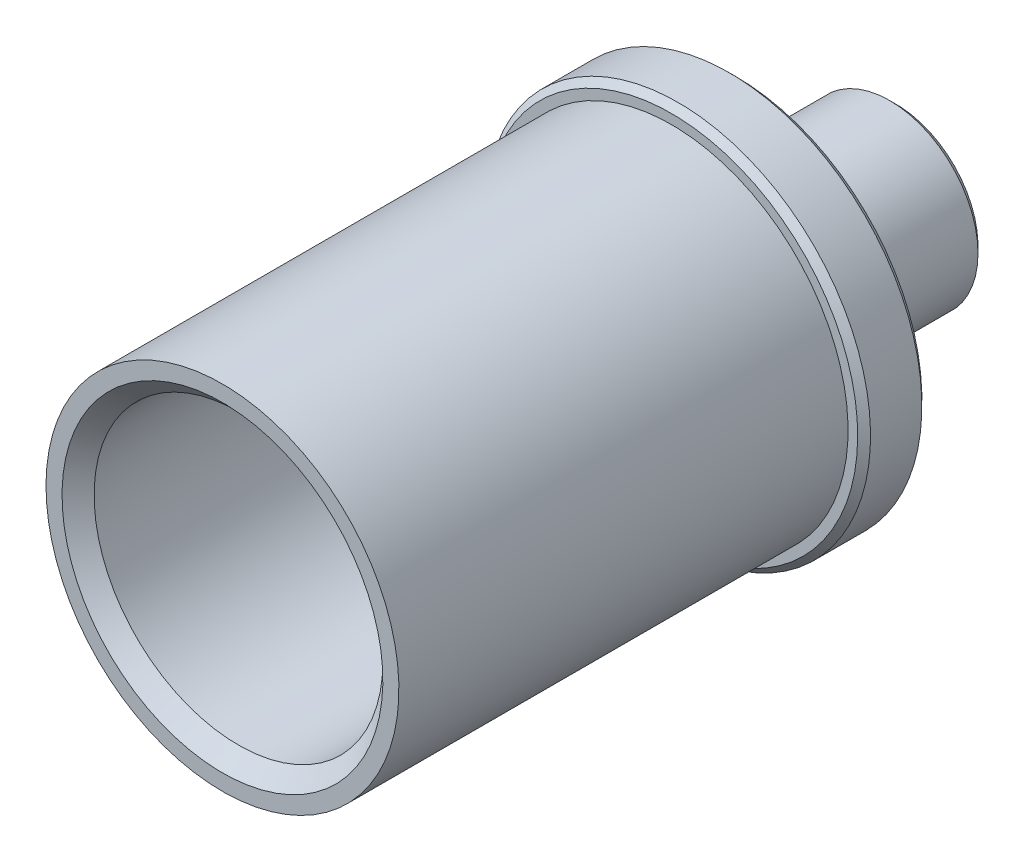
ISO-10303-21;
HEADER;
FILE_DESCRIPTION(('STEP AP214'),'2;1');
FILE_NAME('part.step','',(''),(''),'','','');
FILE_SCHEMA(('AUTOMOTIVE_DESIGN { 1 0 10303 214 1 1 1 1 }'));
ENDSEC;
DATA;
#1=APPLICATION_CONTEXT('core data for automotive mechanical design processes');
#2=APPLICATION_PROTOCOL_DEFINITION('international standard','automotive_design',2000,#1);
#3=PRODUCT_CONTEXT('',#1,'mechanical');
#4=PRODUCT('Part','Part','',(#3));
#5=PRODUCT_RELATED_PRODUCT_CATEGORY('part','',(#4));
#6=PRODUCT_DEFINITION_FORMATION('','',#4);
#7=PRODUCT_DEFINITION_CONTEXT('part definition',#1,'design');
#8=PRODUCT_DEFINITION('design','',#6,#7);
#9=PRODUCT_DEFINITION_SHAPE('','',#8);
#10=(LENGTH_UNIT() NAMED_UNIT(*) SI_UNIT(.MILLI.,.METRE.));
#11=(NAMED_UNIT(*) PLANE_ANGLE_UNIT() SI_UNIT($,.RADIAN.));
#12=(NAMED_UNIT(*) SI_UNIT($,.STERADIAN.) SOLID_ANGLE_UNIT());
#13=UNCERTAINTY_MEASURE_WITH_UNIT(LENGTH_MEASURE(1.E-05),#10,'distance_accuracy_value','');
#14=(GEOMETRIC_REPRESENTATION_CONTEXT(3) GLOBAL_UNCERTAINTY_ASSIGNED_CONTEXT((#13)) GLOBAL_UNIT_ASSIGNED_CONTEXT((#10,
#11,#12)) REPRESENTATION_CONTEXT('',''));
#15=CARTESIAN_POINT('',(0.,0.,0.));
#16=DIRECTION('',(0.,0.,1.));
#17=DIRECTION('',(1.,0.,0.));
#18=AXIS2_PLACEMENT_3D('',#15,#16,#17);
#19=CARTESIAN_POINT('',(-24.8651646720952,0.164165824894193,10.45));
#20=DIRECTION('',(0.,0.,1.));
#21=DIRECTION('',(-0.119393327195775,-0.992847034251059,0.));
#22=AXIS2_PLACEMENT_3D('',#19,#20,#21);
#23=PLANE('',#22);
#24=CARTESIAN_POINT('',(-23.5,0.,10.45));
#25=DIRECTION('',(0.,0.,-1.));
#26=DIRECTION('',(-0.119393327195775,-0.992847034251059,0.));
#27=AXIS2_PLACEMENT_3D('',#24,#25,#26);
#28=CIRCLE('',#27,1.275);
#29=CARTESIAN_POINT('',(-23.6522264921746,-1.2658799686701,10.45));
#30=VERTEX_POINT('',#29);
#31=EDGE_CURVE('E49',#30,#30,#28,.T.);
#32=ORIENTED_EDGE('',*,*,#31,.T.);
#33=EDGE_LOOP('',(#32));
#34=FACE_BOUND('',#33,.T.);
#35=ADVANCED_FACE('F15',(#34),#23,.F.);
#36=CARTESIAN_POINT('',(-26.4785411027531,0.358179981587328,12.95));
#37=DIRECTION('',(0.,0.,1.));
#38=DIRECTION('',(-0.119393327195775,-0.992847034251059,0.));
#39=AXIS2_PLACEMENT_3D('',#36,#37,#38);
#40=PLANE('',#39);
#41=CARTESIAN_POINT('',(-23.5,0.,12.95));
#42=DIRECTION('',(0.,0.,-1.));
#43=DIRECTION('',(0.119393327195775,0.992847034251059,0.));
#44=AXIS2_PLACEMENT_3D('',#41,#42,#43);
#45=CIRCLE('',#44,1.375);
#46=CARTESIAN_POINT('',(-23.3358341751058,1.36516467209521,12.95));
#47=VERTEX_POINT('',#46);
#48=EDGE_CURVE('E44',#47,#47,#45,.T.);
#49=ORIENTED_EDGE('',*,*,#48,.F.);
#50=EDGE_LOOP('',(#49));
#51=FACE_BOUND('',#50,.T.);
#52=CARTESIAN_POINT('',(-23.5,0.,12.95));
#53=DIRECTION('',(0.,0.,-1.));
#54=DIRECTION('',(-0.119393327195775,-0.992847034251059,0.));
#55=AXIS2_PLACEMENT_3D('',#52,#53,#54);
#56=CIRCLE('',#55,2.9);
#57=CARTESIAN_POINT('',(-23.8462406488677,-2.87925639932807,12.95));
#58=VERTEX_POINT('',#57);
#59=EDGE_CURVE('E54',#58,#58,#56,.T.);
#60=ORIENTED_EDGE('',*,*,#59,.T.);
#61=EDGE_LOOP('',(#60));
#62=FACE_BOUND('',#61,.T.);
#63=ADVANCED_FACE('F88',(#51,#62),#40,.F.);
#64=CARTESIAN_POINT('',(-23.5,0.,13.95));
#65=DIRECTION('',(0.,0.,-1.));
#66=DIRECTION('',(0.119393327195775,0.992847034251059,0.));
#67=AXIS2_PLACEMENT_3D('',#64,#65,#66);
#68=PLANE('',#67);
#69=CARTESIAN_POINT('',(-23.5,0.,13.95));
#70=DIRECTION('',(0.,0.,-1.));
#71=DIRECTION('',(0.119393327195775,0.992847034251059,0.));
#72=AXIS2_PLACEMENT_3D('',#69,#70,#71);
#73=CIRCLE('',#72,2.75);
#74=CARTESIAN_POINT('',(-23.1716683502116,2.73032934419041,13.95));
#75=VERTEX_POINT('',#74);
#76=EDGE_CURVE('E19',#75,#75,#73,.T.);
#77=ORIENTED_EDGE('',*,*,#76,.T.);
#78=EDGE_LOOP('',(#77));
#79=FACE_BOUND('',#78,.T.);
#80=CARTESIAN_POINT('',(-23.5,0.,13.95));
#81=DIRECTION('',(0.,0.,1.));
#82=DIRECTION('',(0.119393327195775,0.992847034251059,0.));
#83=AXIS2_PLACEMENT_3D('',#80,#81,#82);
#84=CIRCLE('',#83,2.9);
#85=CARTESIAN_POINT('',(-23.1537593511323,2.87925639932807,13.95));
#86=VERTEX_POINT('',#85);
#87=EDGE_CURVE('E40',#86,#86,#84,.T.);
#88=ORIENTED_EDGE('',*,*,#87,.T.);
#89=EDGE_LOOP('',(#88));
#90=FACE_BOUND('',#89,.T.);
#91=ADVANCED_FACE('F17',(#79,#90),#68,.F.);
#92=CARTESIAN_POINT('',(-25.7339058270649,0.268634986190496,20.95));
#93=DIRECTION('',(0.,0.,-1.));
#94=DIRECTION('',(0.119393327195775,0.992847034251059,0.));
#95=AXIS2_PLACEMENT_3D('',#92,#93,#94);
#96=PLANE('',#95);
#97=CARTESIAN_POINT('',(-23.5,0.,20.95));
#98=DIRECTION('',(0.,0.,-1.));
#99=DIRECTION('',(0.119393327195775,0.992847034251059,0.));
#100=AXIS2_PLACEMENT_3D('',#97,#98,#99);
#101=CIRCLE('',#100,2.75);
#102=CARTESIAN_POINT('',(-23.1716683502116,2.73032934419041,20.95));
#103=VERTEX_POINT('',#102);
#104=EDGE_CURVE('E31',#103,#103,#101,.T.);
#105=ORIENTED_EDGE('',*,*,#104,.F.);
#106=EDGE_LOOP('',(#105));
#107=FACE_BOUND('',#106,.T.);
#108=CARTESIAN_POINT('',(-23.5,0.,20.95));
#109=DIRECTION('',(0.,0.,-1.));
#110=DIRECTION('',(0.119393327195775,0.992847034251059,0.));
#111=AXIS2_PLACEMENT_3D('',#108,#109,#110);
#112=CIRCLE('',#111,2.5);
#113=CARTESIAN_POINT('',(-23.2015166820106,2.48211758562765,20.95));
#114=VERTEX_POINT('',#113);
#115=EDGE_CURVE('E36',#114,#114,#112,.T.);
#116=ORIENTED_EDGE('',*,*,#115,.T.);
#117=EDGE_LOOP('',(#116));
#118=FACE_BOUND('',#117,.T.);
#119=ADVANCED_FACE('F134',(#107,#118),#96,.F.);
#120=CARTESIAN_POINT('',(-23.5,0.,13.95));
#121=DIRECTION('',(0.,0.,-1.));
#122=DIRECTION('',(0.119393327195775,0.992847034251059,0.));
#123=AXIS2_PLACEMENT_3D('',#120,#121,#122);
#124=CIRCLE('',#123,2.25);
#125=CARTESIAN_POINT('',(-23.2313650138095,2.23390582706488,13.95));
#126=VERTEX_POINT('',#125);
#127=EDGE_CURVE('E10',#126,#126,#124,.T.);
#128=ORIENTED_EDGE('',*,*,#127,.F.);
#129=EDGE_LOOP('',(#128));
#130=FACE_BOUND('',#129,.T.);
#131=ADVANCED_FACE('F136',(#130),#68,.F.);
#132=CARTESIAN_POINT('',(-23.5,0.,10.45));
#133=DIRECTION('',(0.,0.,-1.));
#134=DIRECTION('',(0.119393327195775,0.992847034251059,0.));
#135=AXIS2_PLACEMENT_3D('',#132,#133,#134);
#136=CYLINDRICAL_SURFACE('',#135,2.25);
#137=ORIENTED_EDGE('',*,*,#127,.T.);
#138=EDGE_LOOP('',(#137));
#139=FACE_BOUND('',#138,.T.);
#140=CARTESIAN_POINT('',(-23.5,0.,20.7));
#141=DIRECTION('',(0.,0.,1.));
#142=DIRECTION('',(0.119393327195775,0.992847034251059,0.));
#143=AXIS2_PLACEMENT_3D('',#140,#141,#142);
#144=CIRCLE('',#143,2.25);
#145=CARTESIAN_POINT('',(-23.2313650138095,2.23390582706488,20.7));
#146=VERTEX_POINT('',#145);
#147=EDGE_CURVE('E34',#146,#146,#144,.T.);
#148=ORIENTED_EDGE('',*,*,#147,.T.);
#149=EDGE_LOOP('',(#148));
#150=FACE_BOUND('',#149,.T.);
#151=ADVANCED_FACE('F151',(#139,#150),#136,.F.);
#152=CARTESIAN_POINT('',(-23.5,0.,10.45));
#153=DIRECTION('',(0.,0.,-1.));
#154=DIRECTION('',(0.119393327195775,0.992847034251059,0.));
#155=AXIS2_PLACEMENT_3D('',#152,#153,#154);
#156=CYLINDRICAL_SURFACE('',#155,2.75);
#157=ORIENTED_EDGE('',*,*,#76,.F.);
#158=EDGE_LOOP('',(#157));
#159=FACE_BOUND('',#158,.T.);
#160=ORIENTED_EDGE('',*,*,#104,.T.);
#161=EDGE_LOOP('',(#160));
#162=FACE_BOUND('',#161,.T.);
#163=ADVANCED_FACE('F159',(#159,#162),#156,.T.);
#164=CARTESIAN_POINT('',(-23.5,0.,10.45));
#165=DIRECTION('',(0.,0.,-1.));
#166=DIRECTION('',(0.119393327195775,0.992847034251059,0.));
#167=AXIS2_PLACEMENT_3D('',#164,#165,#166);
#168=CYLINDRICAL_SURFACE('',#167,3.);
#169=CARTESIAN_POINT('',(-23.5,0.,13.05));
#170=DIRECTION('',(0.,0.,1.));
#171=DIRECTION('',(-0.119393327195775,-0.992847034251059,0.));
#172=AXIS2_PLACEMENT_3D('',#169,#170,#171);
#173=CIRCLE('',#172,3.);
#174=CARTESIAN_POINT('',(-23.8581799815873,-2.97854110275317,13.05));
#175=VERTEX_POINT('',#174);
#176=EDGE_CURVE('E53',#175,#175,#173,.T.);
#177=ORIENTED_EDGE('',*,*,#176,.T.);
#178=EDGE_LOOP('',(#177));
#179=FACE_BOUND('',#178,.T.);
#180=CARTESIAN_POINT('',(-23.5,0.,13.85));
#181=DIRECTION('',(0.,0.,-1.));
#182=DIRECTION('',(0.119393327195775,0.992847034251059,0.));
#183=AXIS2_PLACEMENT_3D('',#180,#181,#182);
#184=CIRCLE('',#183,3.);
#185=CARTESIAN_POINT('',(-23.1418200184127,2.97854110275318,13.85));
#186=VERTEX_POINT('',#185);
#187=EDGE_CURVE('E58',#186,#186,#184,.T.);
#188=ORIENTED_EDGE('',*,*,#187,.T.);
#189=EDGE_LOOP('',(#188));
#190=FACE_BOUND('',#189,.T.);
#191=ADVANCED_FACE('F167',(#179,#190),#168,.T.);
#192=CARTESIAN_POINT('',(-23.5,0.,10.45));
#193=DIRECTION('',(0.,0.,-1.));
#194=DIRECTION('',(0.119393327195775,0.992847034251059,0.));
#195=AXIS2_PLACEMENT_3D('',#192,#193,#194);
#196=CYLINDRICAL_SURFACE('',#195,1.375);
#197=CARTESIAN_POINT('',(-23.5,0.,10.55));
#198=DIRECTION('',(0.,0.,1.));
#199=DIRECTION('',(-0.119393327195775,-0.992847034251059,0.));
#200=AXIS2_PLACEMENT_3D('',#197,#198,#199);
#201=CIRCLE('',#200,1.375);
#202=CARTESIAN_POINT('',(-23.6641658248942,-1.3651646720952,10.55));
#203=VERTEX_POINT('',#202);
#204=EDGE_CURVE('E48',#203,#203,#201,.T.);
#205=ORIENTED_EDGE('',*,*,#204,.T.);
#206=EDGE_LOOP('',(#205));
#207=FACE_BOUND('',#206,.T.);
#208=ORIENTED_EDGE('',*,*,#48,.T.);
#209=EDGE_LOOP('',(#208));
#210=FACE_BOUND('',#209,.T.);
#211=ADVANCED_FACE('F77',(#207,#210),#196,.T.);
#212=CARTESIAN_POINT('',(-23.5,0.,10.45));
#213=DIRECTION('',(0.,0.,1.));
#214=DIRECTION('',(-0.119393327195775,-0.992847034251059,0.));
#215=AXIS2_PLACEMENT_3D('',#212,#213,#214);
#216=CONICAL_SURFACE('',#215,1.275,0.785398163397446);
#217=ORIENTED_EDGE('',*,*,#204,.F.);
#218=EDGE_LOOP('',(#217));
#219=FACE_BOUND('',#218,.T.);
#220=ORIENTED_EDGE('',*,*,#31,.F.);
#221=EDGE_LOOP('',(#220));
#222=FACE_BOUND('',#221,.T.);
#223=ADVANCED_FACE('F80',(#219,#222),#216,.T.);
#224=CARTESIAN_POINT('',(-23.5,0.,12.95));
#225=DIRECTION('',(0.,0.,1.));
#226=DIRECTION('',(-0.119393327195775,-0.992847034251059,0.));
#227=AXIS2_PLACEMENT_3D('',#224,#225,#226);
#228=CONICAL_SURFACE('',#227,2.9,0.785398163397446);
#229=ORIENTED_EDGE('',*,*,#176,.F.);
#230=EDGE_LOOP('',(#229));
#231=FACE_BOUND('',#230,.T.);
#232=ORIENTED_EDGE('',*,*,#59,.F.);
#233=EDGE_LOOP('',(#232));
#234=FACE_BOUND('',#233,.T.);
#235=ADVANCED_FACE('F83',(#231,#234),#228,.T.);
#236=CARTESIAN_POINT('',(-23.5,0.,13.85));
#237=DIRECTION('',(0.,0.,-1.));
#238=DIRECTION('',(0.119393327195775,0.992847034251059,0.));
#239=AXIS2_PLACEMENT_3D('',#236,#237,#238);
#240=CONICAL_SURFACE('',#239,3.,0.785398163397446);
#241=ORIENTED_EDGE('',*,*,#187,.F.);
#242=EDGE_LOOP('',(#241));
#243=FACE_BOUND('',#242,.T.);
#244=ORIENTED_EDGE('',*,*,#87,.F.);
#245=EDGE_LOOP('',(#244));
#246=FACE_BOUND('',#245,.T.);
#247=ADVANCED_FACE('F99',(#243,#246),#240,.T.);
#248=CARTESIAN_POINT('',(-23.5,0.,20.95));
#249=DIRECTION('',(0.,0.,1.));
#250=DIRECTION('',(-0.119393327195775,-0.992847034251059,0.));
#251=AXIS2_PLACEMENT_3D('',#248,#249,#250);
#252=CONICAL_SURFACE('',#251,2.5,0.785398163397448);
#253=ORIENTED_EDGE('',*,*,#115,.F.);
#254=EDGE_LOOP('',(#253));
#255=FACE_BOUND('',#254,.T.);
#256=ORIENTED_EDGE('',*,*,#147,.F.);
#257=EDGE_LOOP('',(#256));
#258=FACE_BOUND('',#257,.T.);
#259=ADVANCED_FACE('F101',(#255,#258),#252,.F.);
#260=CLOSED_SHELL('',(#35,#63,#91,#119,#131,#151,#163,#191,#211,#223,#235,#247,#259));
#261=MANIFOLD_SOLID_BREP('B1',#260);
#262=ADVANCED_BREP_SHAPE_REPRESENTATION('',(#18,#261),#14);
#263=SHAPE_DEFINITION_REPRESENTATION(#9,#262);
ENDSEC;
END-ISO-10303-21;
